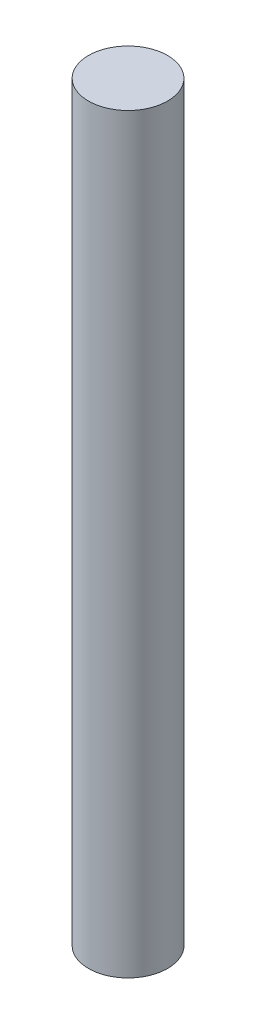
ISO-10303-21;
HEADER;
FILE_DESCRIPTION(('STEP AP214'),'2;1');
FILE_NAME('part.step','',(''),(''),'','','');
FILE_SCHEMA(('AUTOMOTIVE_DESIGN { 1 0 10303 214 1 1 1 1 }'));
ENDSEC;
DATA;
#1=APPLICATION_CONTEXT('core data for automotive mechanical design processes');
#2=APPLICATION_PROTOCOL_DEFINITION('international standard','automotive_design',2000,#1);
#3=PRODUCT_CONTEXT('',#1,'mechanical');
#4=PRODUCT('Part','Part','',(#3));
#5=PRODUCT_RELATED_PRODUCT_CATEGORY('part','',(#4));
#6=PRODUCT_DEFINITION_FORMATION('','',#4);
#7=PRODUCT_DEFINITION_CONTEXT('part definition',#1,'design');
#8=PRODUCT_DEFINITION('design','',#6,#7);
#9=PRODUCT_DEFINITION_SHAPE('','',#8);
#10=(LENGTH_UNIT() NAMED_UNIT(*) SI_UNIT(.MILLI.,.METRE.));
#11=(NAMED_UNIT(*) PLANE_ANGLE_UNIT() SI_UNIT($,.RADIAN.));
#12=(NAMED_UNIT(*) SI_UNIT($,.STERADIAN.) SOLID_ANGLE_UNIT());
#13=UNCERTAINTY_MEASURE_WITH_UNIT(LENGTH_MEASURE(1.E-05),#10,'distance_accuracy_value','');
#14=(GEOMETRIC_REPRESENTATION_CONTEXT(3) GLOBAL_UNCERTAINTY_ASSIGNED_CONTEXT((#13)) GLOBAL_UNIT_ASSIGNED_CONTEXT((#10,
#11,#12)) REPRESENTATION_CONTEXT('',''));
#15=CARTESIAN_POINT('',(0.,0.,0.));
#16=DIRECTION('',(0.,0.,1.));
#17=DIRECTION('',(1.,0.,0.));
#18=AXIS2_PLACEMENT_3D('',#15,#16,#17);
#19=CARTESIAN_POINT('',(0.,-38.,-22.));
#20=DIRECTION('',(0.,-1.,0.));
#21=DIRECTION('',(0.,0.,-1.));
#22=AXIS2_PLACEMENT_3D('',#19,#20,#21);
#23=PLANE('',#22);
#24=CARTESIAN_POINT('',(0.,-38.,-22.));
#25=DIRECTION('',(0.,-1.,0.));
#26=DIRECTION('',(0.,0.,-1.));
#27=AXIS2_PLACEMENT_3D('',#24,#25,#26);
#28=CIRCLE('',#27,4.);
#29=CARTESIAN_POINT('',(0.,-38.,-26.));
#30=VERTEX_POINT('',#29);
#31=EDGE_CURVE('E18',#30,#30,#28,.F.);
#32=ORIENTED_EDGE('',*,*,#31,.F.);
#33=EDGE_LOOP('',(#32));
#34=FACE_BOUND('',#33,.T.);
#35=ADVANCED_FACE('F15',(#34),#23,.T.);
#36=CARTESIAN_POINT('',(0.,38.,-22.));
#37=DIRECTION('',(0.,1.,0.));
#38=DIRECTION('',(0.,0.,1.));
#39=AXIS2_PLACEMENT_3D('',#36,#37,#38);
#40=PLANE('',#39);
#41=CARTESIAN_POINT('',(0.,38.,-22.));
#42=DIRECTION('',(0.,-1.,0.));
#43=DIRECTION('',(0.,0.,-1.));
#44=AXIS2_PLACEMENT_3D('',#41,#42,#43);
#45=CIRCLE('',#44,4.);
#46=CARTESIAN_POINT('',(0.,38.,-26.));
#47=VERTEX_POINT('',#46);
#48=EDGE_CURVE('E10',#47,#47,#45,.T.);
#49=ORIENTED_EDGE('',*,*,#48,.F.);
#50=EDGE_LOOP('',(#49));
#51=FACE_BOUND('',#50,.T.);
#52=ADVANCED_FACE('F30',(#51),#40,.T.);
#53=CARTESIAN_POINT('',(0.,0.,-22.));
#54=DIRECTION('',(0.,-1.,0.));
#55=DIRECTION('',(0.,0.,-1.));
#56=AXIS2_PLACEMENT_3D('',#53,#54,#55);
#57=CYLINDRICAL_SURFACE('',#56,4.);
#58=ORIENTED_EDGE('',*,*,#31,.T.);
#59=EDGE_LOOP('',(#58));
#60=FACE_BOUND('',#59,.T.);
#61=ORIENTED_EDGE('',*,*,#48,.T.);
#62=EDGE_LOOP('',(#61));
#63=FACE_BOUND('',#62,.T.);
#64=ADVANCED_FACE('F27',(#60,#63),#57,.T.);
#65=CLOSED_SHELL('',(#35,#52,#64));
#66=MANIFOLD_SOLID_BREP('B1',#65);
#67=ADVANCED_BREP_SHAPE_REPRESENTATION('',(#18,#66),#14);
#68=SHAPE_DEFINITION_REPRESENTATION(#9,#67);
ENDSEC;
END-ISO-10303-21;
